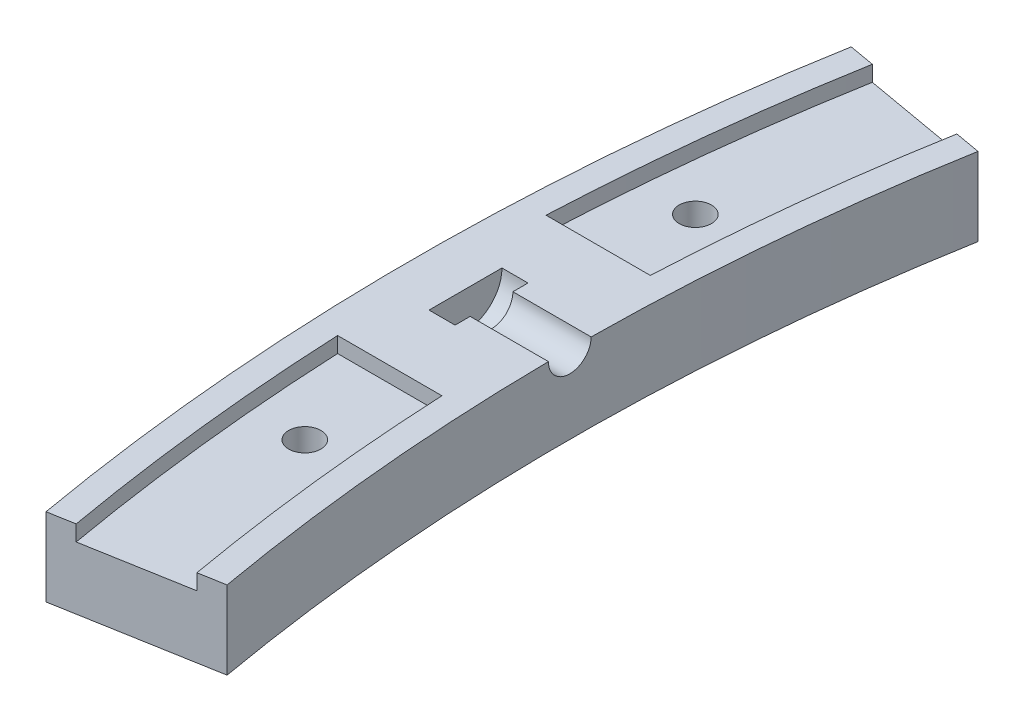
ISO-10303-21;
HEADER;
FILE_DESCRIPTION(('STEP AP214'),'2;1');
FILE_NAME('part.step','',(''),(''),'','','');
FILE_SCHEMA(('AUTOMOTIVE_DESIGN { 1 0 10303 214 1 1 1 1 }'));
ENDSEC;
DATA;
#1=APPLICATION_CONTEXT('core data for automotive mechanical design processes');
#2=APPLICATION_PROTOCOL_DEFINITION('international standard','automotive_design',2000,#1);
#3=PRODUCT_CONTEXT('',#1,'mechanical');
#4=PRODUCT('Part','Part','',(#3));
#5=PRODUCT_RELATED_PRODUCT_CATEGORY('part','',(#4));
#6=PRODUCT_DEFINITION_FORMATION('','',#4);
#7=PRODUCT_DEFINITION_CONTEXT('part definition',#1,'design');
#8=PRODUCT_DEFINITION('design','',#6,#7);
#9=PRODUCT_DEFINITION_SHAPE('','',#8);
#10=(LENGTH_UNIT() NAMED_UNIT(*) SI_UNIT(.MILLI.,.METRE.));
#11=(NAMED_UNIT(*) PLANE_ANGLE_UNIT() SI_UNIT($,.RADIAN.));
#12=(NAMED_UNIT(*) SI_UNIT($,.STERADIAN.) SOLID_ANGLE_UNIT());
#13=UNCERTAINTY_MEASURE_WITH_UNIT(LENGTH_MEASURE(1.E-05),#10,'distance_accuracy_value','');
#14=(GEOMETRIC_REPRESENTATION_CONTEXT(3) GLOBAL_UNCERTAINTY_ASSIGNED_CONTEXT((#13)) GLOBAL_UNIT_ASSIGNED_CONTEXT((#10,
#11,#12)) REPRESENTATION_CONTEXT('',''));
#15=CARTESIAN_POINT('',(0.,0.,0.));
#16=DIRECTION('',(0.,0.,1.));
#17=DIRECTION('',(1.,0.,0.));
#18=AXIS2_PLACEMENT_3D('',#15,#16,#17);
#19=CARTESIAN_POINT('',(0.,7.5,0.));
#20=DIRECTION('',(0.,1.,0.));
#21=DIRECTION('',(0.,0.,1.));
#22=AXIS2_PLACEMENT_3D('',#19,#20,#21);
#23=PLANE('',#22);
#24=DIRECTION('',(0.,0.,-1.));
#25=VECTOR('',#24,1.);
#26=CARTESIAN_POINT('',(-215.,7.5,0.));
#27=LINE('',#26,#25);
#28=CARTESIAN_POINT('',(-215.,7.5,-2.05000000000003));
#29=VERTEX_POINT('',#28);
#30=CARTESIAN_POINT('',(-215.,7.5,-3.50000000000003));
#31=VERTEX_POINT('',#30);
#32=EDGE_CURVE('E163',#29,#31,#27,.T.);
#33=ORIENTED_EDGE('',*,*,#32,.F.);
#34=DIRECTION('',(-1.,0.,0.));
#35=VECTOR('',#34,1.);
#36=CARTESIAN_POINT('',(-204.347608750033,7.5,-2.05000000000003));
#37=LINE('',#36,#35);
#38=CARTESIAN_POINT('',(-207.489873246865,7.5,-2.05000000000003));
#39=VERTEX_POINT('',#38);
#40=EDGE_CURVE('E51',#29,#39,#37,.F.);
#41=ORIENTED_EDGE('',*,*,#40,.T.);
#42=CARTESIAN_POINT('',(0.,7.5,0.));
#43=DIRECTION('',(0.,-1.,0.));
#44=DIRECTION('',(0.,0.,1.));
#45=AXIS2_PLACEMENT_3D('',#42,#43,#44);
#46=CIRCLE('',#45,207.5);
#47=CARTESIAN_POINT('',(-204.347608750033,7.5,-36.0319968658881));
#48=VERTEX_POINT('',#47);
#49=EDGE_CURVE('E278',#39,#48,#46,.T.);
#50=ORIENTED_EDGE('',*,*,#49,.T.);
#51=DIRECTION('',(-0.984807753012208,0.,-0.173648177666931));
#52=VECTOR('',#51,1.);
#53=CARTESIAN_POINT('',(-219.119725045216,7.5,-38.6367195308921));
#54=LINE('',#53,#52);
#55=CARTESIAN_POINT('',(-206.809628132564,7.5,-36.4661173100556));
#56=VERTEX_POINT('',#55);
#57=EDGE_CURVE('E265',#48,#56,#54,.T.);
#58=ORIENTED_EDGE('',*,*,#57,.T.);
#59=CARTESIAN_POINT('',(0.,7.5,0.));
#60=DIRECTION('',(0.,1.,0.));
#61=DIRECTION('',(0.,0.,1.));
#62=AXIS2_PLACEMENT_3D('',#59,#60,#61);
#63=CIRCLE('',#62,210.);
#64=CARTESIAN_POINT('',(-209.76176963403,7.5,-9.99999999999995));
#65=VERTEX_POINT('',#64);
#66=EDGE_CURVE('E276',#56,#65,#63,.T.);
#67=ORIENTED_EDGE('',*,*,#66,.T.);
#68=DIRECTION('',(-1.,0.,0.));
#69=VECTOR('',#68,1.);
#70=CARTESIAN_POINT('',(0.,7.5,-10.0000000000001));
#71=LINE('',#70,#69);
#72=CARTESIAN_POINT('',(-219.772609758359,7.5,-9.99999999999995));
#73=VERTEX_POINT('',#72);
#74=EDGE_CURVE('E363',#65,#73,#71,.T.);
#75=ORIENTED_EDGE('',*,*,#74,.T.);
#76=CARTESIAN_POINT('',(0.,7.5,0.));
#77=DIRECTION('',(0.,1.,0.));
#78=DIRECTION('',(0.,0.,1.));
#79=AXIS2_PLACEMENT_3D('',#76,#77,#78);
#80=CIRCLE('',#79,220.);
#81=CARTESIAN_POINT('',(-216.657705662686,7.5,-38.2025990867247));
#82=VERTEX_POINT('',#81);
#83=EDGE_CURVE('E370',#82,#73,#80,.T.);
#84=ORIENTED_EDGE('',*,*,#83,.F.);
#85=CARTESIAN_POINT('',(-219.119725045216,7.5,-38.6367195308921));
#86=VERTEX_POINT('',#85);
#87=EDGE_CURVE('E281',#82,#86,#54,.T.);
#88=ORIENTED_EDGE('',*,*,#87,.T.);
#89=CARTESIAN_POINT('',(0.,7.5,0.));
#90=DIRECTION('',(0.,1.,0.));
#91=DIRECTION('',(0.,0.,1.));
#92=AXIS2_PLACEMENT_3D('',#89,#90,#91);
#93=CIRCLE('',#92,222.5);
#94=CARTESIAN_POINT('',(-219.119725045216,7.5,38.6367195308921));
#95=VERTEX_POINT('',#94);
#96=EDGE_CURVE('E298',#86,#95,#93,.T.);
#97=ORIENTED_EDGE('',*,*,#96,.T.);
#98=DIRECTION('',(0.984807753012208,0.,-0.173648177666931));
#99=VECTOR('',#98,1.);
#100=CARTESIAN_POINT('',(-204.347608750033,7.5,36.0319968658881));
#101=LINE('',#100,#99);
#102=CARTESIAN_POINT('',(-216.657705662686,7.5,38.2025990867249));
#103=VERTEX_POINT('',#102);
#104=EDGE_CURVE('E310',#95,#103,#101,.T.);
#105=ORIENTED_EDGE('',*,*,#104,.T.);
#106=CARTESIAN_POINT('',(0.,7.5,0.));
#107=DIRECTION('',(0.,1.,0.));
#108=DIRECTION('',(0.,0.,1.));
#109=AXIS2_PLACEMENT_3D('',#106,#107,#108);
#110=CIRCLE('',#109,220.);
#111=CARTESIAN_POINT('',(-219.772609758359,7.5,10.));
#112=VERTEX_POINT('',#111);
#113=EDGE_CURVE('E325',#112,#103,#110,.T.);
#114=ORIENTED_EDGE('',*,*,#113,.F.);
#115=DIRECTION('',(1.,0.,0.));
#116=VECTOR('',#115,1.);
#117=CARTESIAN_POINT('',(0.,7.5,10.0000000000001));
#118=LINE('',#117,#116);
#119=CARTESIAN_POINT('',(-209.76176963403,7.5,10.));
#120=VERTEX_POINT('',#119);
#121=EDGE_CURVE('E328',#112,#120,#118,.T.);
#122=ORIENTED_EDGE('',*,*,#121,.T.);
#123=CARTESIAN_POINT('',(0.,7.5,0.));
#124=DIRECTION('',(0.,1.,0.));
#125=DIRECTION('',(0.,0.,1.));
#126=AXIS2_PLACEMENT_3D('',#123,#124,#125);
#127=CIRCLE('',#126,210.);
#128=CARTESIAN_POINT('',(-206.809628132564,7.5,36.4661173100556));
#129=VERTEX_POINT('',#128);
#130=EDGE_CURVE('E333',#120,#129,#127,.T.);
#131=ORIENTED_EDGE('',*,*,#130,.T.);
#132=CARTESIAN_POINT('',(-204.347608750033,7.5,36.0319968658881));
#133=VERTEX_POINT('',#132);
#134=EDGE_CURVE('E318',#129,#133,#101,.T.);
#135=ORIENTED_EDGE('',*,*,#134,.T.);
#136=CARTESIAN_POINT('',(-207.489873246865,7.5,2.04999999999997));
#137=VERTEX_POINT('',#136);
#138=EDGE_CURVE('E158',#133,#137,#46,.T.);
#139=ORIENTED_EDGE('',*,*,#138,.T.);
#140=DIRECTION('',(-1.,0.,0.));
#141=VECTOR('',#140,1.);
#142=CARTESIAN_POINT('',(-204.347608750033,7.5,2.04999999999997));
#143=LINE('',#142,#141);
#144=CARTESIAN_POINT('',(-215.,7.5,2.04999999999997));
#145=VERTEX_POINT('',#144);
#146=EDGE_CURVE('E149',#137,#145,#143,.T.);
#147=ORIENTED_EDGE('',*,*,#146,.T.);
#148=CARTESIAN_POINT('',(-215.,7.5,3.49999999999997));
#149=VERTEX_POINT('',#148);
#150=EDGE_CURVE('E156',#149,#145,#27,.T.);
#151=ORIENTED_EDGE('',*,*,#150,.F.);
#152=DIRECTION('',(1.,0.,0.));
#153=VECTOR('',#152,1.);
#154=CARTESIAN_POINT('',(-217.5,7.5,3.49999999999997));
#155=LINE('',#154,#153);
#156=CARTESIAN_POINT('',(-217.5,7.5,3.49999999999997));
#157=VERTEX_POINT('',#156);
#158=EDGE_CURVE('E165',#157,#149,#155,.T.);
#159=ORIENTED_EDGE('',*,*,#158,.F.);
#160=DIRECTION('',(0.,0.,-1.));
#161=VECTOR('',#160,1.);
#162=CARTESIAN_POINT('',(-217.5,7.5,0.));
#163=LINE('',#162,#161);
#164=CARTESIAN_POINT('',(-217.5,7.5,-3.50000000000003));
#165=VERTEX_POINT('',#164);
#166=EDGE_CURVE('E44',#157,#165,#163,.T.);
#167=ORIENTED_EDGE('',*,*,#166,.T.);
#168=DIRECTION('',(1.,0.,0.));
#169=VECTOR('',#168,1.);
#170=CARTESIAN_POINT('',(-217.5,7.5,-3.50000000000003));
#171=LINE('',#170,#169);
#172=EDGE_CURVE('E162',#31,#165,#171,.F.);
#173=ORIENTED_EDGE('',*,*,#172,.F.);
#174=EDGE_LOOP('',(#33,#41,#50,#58,#67,#75,#84,#88,#97,#105,#114,#122,#131,#135,#139,#147,#151,
#159,#167,#173));
#175=FACE_BOUND('',#174,.T.);
#176=ADVANCED_FACE('F35',(#175),#23,.T.);
#177=CARTESIAN_POINT('',(0.,7.5,0.));
#178=DIRECTION('',(0.,-1.,0.));
#179=DIRECTION('',(0.,0.,-1.));
#180=AXIS2_PLACEMENT_3D('',#177,#178,#179);
#181=CYLINDRICAL_SURFACE('',#180,207.5);
#182=CARTESIAN_POINT('',(-207.489873246865,7.5,2.04999999999997));
#183=CARTESIAN_POINT('',(-207.489873112115,7.4423267773774,2.04999961874439));
#184=CARTESIAN_POINT('',(-207.489897323521,7.3846811873352,2.04756466829248));
#185=CARTESIAN_POINT('',(-207.489993010362,7.26980251110975,2.03785066983751));
#186=CARTESIAN_POINT('',(-207.490064483525,7.21256940523499,2.03057185464416));
#187=CARTESIAN_POINT('',(-207.490347355248,7.04219804038056,2.00153779102663));
#188=CARTESIAN_POINT('',(-207.490627214969,6.93020109577207,1.97258473937086));
#189=CARTESIAN_POINT('',(-207.491338438396,6.7126631089907,1.89628879865608));
#190=CARTESIAN_POINT('',(-207.491769872239,6.60712508212359,1.84893739511039));
#191=CARTESIAN_POINT('',(-207.49273544386,6.40550172133171,1.73719531036377));
#192=CARTESIAN_POINT('',(-207.493269561529,6.30941454218551,1.67280796442357));
#193=CARTESIAN_POINT('',(-207.494380389939,6.1294114605521,1.52881471104663));
#194=CARTESIAN_POINT('',(-207.494957102911,6.0454961967325,1.44920800554874));
#195=CARTESIAN_POINT('',(-207.496088173847,5.89220729571771,1.27702384443452));
#196=CARTESIAN_POINT('',(-207.496642528392,5.8228358749963,1.18444441536379));
#197=CARTESIAN_POINT('',(-207.49766627226,5.70062318173759,0.988954551643307));
#198=CARTESIAN_POINT('',(-207.498135663594,5.64778151765516,0.88604436177756));
#199=CARTESIAN_POINT('',(-207.498936547642,5.56012883511326,0.672819361395598));
#200=CARTESIAN_POINT('',(-207.499268049205,5.52531665961146,0.562505026553703));
#201=CARTESIAN_POINT('',(-207.499755821048,5.47470668258269,0.337598710251014));
#202=CARTESIAN_POINT('',(-207.499912093538,5.45890864121722,0.22300678276527));
#203=CARTESIAN_POINT('',(-207.500031797858,5.4467745828185,-0.00720562877474218));
#204=CARTESIAN_POINT('',(-207.499995225299,5.45043900875719,-0.122826136180022));
#205=CARTESIAN_POINT('',(-207.499733358717,5.47712623948218,-0.351805502754212));
#206=CARTESIAN_POINT('',(-207.499508073155,5.50014817630441,-0.465164463094469));
#207=CARTESIAN_POINT('',(-207.498894190051,5.5648955326389,-0.686407934748474));
#208=CARTESIAN_POINT('',(-207.498505593007,5.60662089499921,-0.794292462789289));
#209=CARTESIAN_POINT('',(-207.497608873338,5.70759259971319,-1.00152986625007));
#210=CARTESIAN_POINT('',(-207.49710074546,5.76683971202467,-1.10088236649974));
#211=CARTESIAN_POINT('',(-207.496022284363,5.90116958629022,-1.28822582777586));
#212=CARTESIAN_POINT('',(-207.495451954187,5.97625157349768,-1.37621734431719));
#213=CARTESIAN_POINT('',(-207.49431340944,6.14011242982959,-1.53833981562478));
#214=CARTESIAN_POINT('',(-207.49374519468,6.22889004474803,-1.61247203821151));
#215=CARTESIAN_POINT('',(-207.492674703444,6.41766570271724,-1.74480366525922));
#216=CARTESIAN_POINT('',(-207.492172447978,6.51766730200719,-1.80299799970906));
#217=CARTESIAN_POINT('',(-207.491290450375,6.72606417828469,-1.90179901283657));
#218=CARTESIAN_POINT('',(-207.490910782999,6.83446452740496,-1.942394964446));
#219=CARTESIAN_POINT('',(-207.490317771501,7.056458109655,-2.00474925697139));
#220=CARTESIAN_POINT('',(-207.490104173403,7.17004313081143,-2.02653636879362));
#221=CARTESIAN_POINT('',(-207.489947910169,7.3203192776388,-2.04242998940697));
#222=CARTESIAN_POINT('',(-207.489919925655,7.3562282993136,-2.04527024245444));
#223=CARTESIAN_POINT('',(-207.489882619008,7.42808670006453,-2.04905265607338));
#224=CARTESIAN_POINT('',(-207.489873266096,7.46403591425759,-2.04999794707387));
#225=CARTESIAN_POINT('',(-207.489873246865,7.5,-2.05000000000003));
#226=B_SPLINE_CURVE_WITH_KNOTS('',3,(#182,#183,#184,#185,#186,#187,#188,#189,#190,#191,#192,
#193,#194,#195,#196,#197,#198,#199,#200,#201,#202,#203,#204,#205,#206,#207,#208,#209,#210,#211,
#212,#213,#214,#215,#216,#217,#218,#219,#220,#221,#222,#223,#224,#225),.UNSPECIFIED.,.F.,.F.,(4,
2,2,2,2,2,2,2,2,2,2,2,2,2,2,2,2,2,2,2,2,4),(0.,0.17291339027685,0.34581847045188,
0.691075842377868,1.0364931850116,1.38184295254384,1.7272108342329,2.07263131159989,
2.41804360627244,2.76343373136544,3.10881949976694,3.45421312929192,3.79959127266908,
4.14496836068347,4.49036062784999,4.8357360000652,5.1810797625568,5.52653325529349,
5.87219702361998,6.21733110637327,6.32535981214613,6.43320990969692),.UNSPECIFIED.);
#227=EDGE_CURVE('E159',#137,#39,#226,.T.);
#228=ORIENTED_EDGE('',*,*,#227,.F.);
#229=ORIENTED_EDGE('',*,*,#138,.F.);
#230=DIRECTION('',(0.,-1.,0.));
#231=VECTOR('',#230,1.);
#232=CARTESIAN_POINT('',(-204.347608750033,7.5,36.0319968658881));
#233=LINE('',#232,#231);
#234=CARTESIAN_POINT('',(-204.347608750033,0.,36.0319968658881));
#235=VERTEX_POINT('',#234);
#236=EDGE_CURVE('E300',#133,#235,#233,.T.);
#237=ORIENTED_EDGE('',*,*,#236,.T.);
#238=CARTESIAN_POINT('',(0.,0.,0.));
#239=DIRECTION('',(0.,-1.,0.));
#240=DIRECTION('',(0.,0.,1.));
#241=AXIS2_PLACEMENT_3D('',#238,#239,#240);
#242=CIRCLE('',#241,207.5);
#243=CARTESIAN_POINT('',(-204.347608750033,0.,-36.0319968658881));
#244=VERTEX_POINT('',#243);
#245=EDGE_CURVE('E295',#235,#244,#242,.T.);
#246=ORIENTED_EDGE('',*,*,#245,.T.);
#247=DIRECTION('',(0.,-1.,0.));
#248=VECTOR('',#247,1.);
#249=CARTESIAN_POINT('',(-204.347608750033,7.5,-36.0319968658881));
#250=LINE('',#249,#248);
#251=EDGE_CURVE('E284',#48,#244,#250,.T.);
#252=ORIENTED_EDGE('',*,*,#251,.F.);
#253=ORIENTED_EDGE('',*,*,#49,.F.);
#254=EDGE_LOOP('',(#228,#229,#237,#246,#252,#253));
#255=FACE_BOUND('',#254,.T.);
#256=ADVANCED_FACE('F193',(#255),#181,.F.);
#257=CARTESIAN_POINT('',(-204.347608750033,7.5,36.0319968658881));
#258=DIRECTION('',(-0.173648177666931,0.,-0.984807753012208));
#259=DIRECTION('',(-0.984807753012208,0.,0.173648177666931));
#260=AXIS2_PLACEMENT_3D('',#257,#258,#259);
#261=PLANE('',#260);
#262=DIRECTION('',(0.,1.,0.));
#263=VECTOR('',#262,1.);
#264=CARTESIAN_POINT('',(-206.809628132564,6.,36.4661173100556));
#265=LINE('',#264,#263);
#266=CARTESIAN_POINT('',(-206.809628132564,6.,36.4661173100556));
#267=VERTEX_POINT('',#266);
#268=EDGE_CURVE('E337',#267,#129,#265,.T.);
#269=ORIENTED_EDGE('',*,*,#268,.F.);
#270=DIRECTION('',(0.984807753012208,0.,-0.173648177666931));
#271=VECTOR('',#270,1.);
#272=CARTESIAN_POINT('',(0.,6.,0.));
#273=LINE('',#272,#271);
#274=CARTESIAN_POINT('',(-216.657705662686,6.,38.2025990867249));
#275=VERTEX_POINT('',#274);
#276=EDGE_CURVE('E343',#275,#267,#273,.T.);
#277=ORIENTED_EDGE('',*,*,#276,.F.);
#278=DIRECTION('',(0.,1.,0.));
#279=VECTOR('',#278,1.);
#280=CARTESIAN_POINT('',(-216.657705662686,6.,38.2025990867249));
#281=LINE('',#280,#279);
#282=EDGE_CURVE('E339',#275,#103,#281,.T.);
#283=ORIENTED_EDGE('',*,*,#282,.T.);
#284=ORIENTED_EDGE('',*,*,#104,.F.);
#285=DIRECTION('',(0.,-1.,0.));
#286=VECTOR('',#285,1.);
#287=CARTESIAN_POINT('',(-219.119725045216,7.5,38.6367195308921));
#288=LINE('',#287,#286);
#289=CARTESIAN_POINT('',(-219.119725045216,0.,38.6367195308921));
#290=VERTEX_POINT('',#289);
#291=EDGE_CURVE('E167',#95,#290,#288,.T.);
#292=ORIENTED_EDGE('',*,*,#291,.T.);
#293=DIRECTION('',(0.984807753012208,0.,-0.173648177666931));
#294=VECTOR('',#293,1.);
#295=CARTESIAN_POINT('',(-204.347608750033,0.,36.0319968658881));
#296=LINE('',#295,#294);
#297=EDGE_CURVE('E292',#290,#235,#296,.T.);
#298=ORIENTED_EDGE('',*,*,#297,.T.);
#299=ORIENTED_EDGE('',*,*,#236,.F.);
#300=ORIENTED_EDGE('',*,*,#134,.F.);
#301=EDGE_LOOP('',(#269,#277,#283,#284,#292,#298,#299,#300));
#302=FACE_BOUND('',#301,.T.);
#303=ADVANCED_FACE('F251',(#302),#261,.F.);
#304=CARTESIAN_POINT('',(-219.119725045216,7.5,-38.6367195308921));
#305=DIRECTION('',(-0.173648177666931,0.,0.984807753012208));
#306=DIRECTION('',(0.984807753012208,0.,0.173648177666931));
#307=AXIS2_PLACEMENT_3D('',#304,#305,#306);
#308=PLANE('',#307);
#309=DIRECTION('',(0.,1.,0.));
#310=VECTOR('',#309,1.);
#311=CARTESIAN_POINT('',(-206.809628132564,6.,-36.4661173100556));
#312=LINE('',#311,#310);
#313=CARTESIAN_POINT('',(-206.809628132564,6.,-36.4661173100556));
#314=VERTEX_POINT('',#313);
#315=EDGE_CURVE('E262',#314,#56,#312,.T.);
#316=ORIENTED_EDGE('',*,*,#315,.T.);
#317=ORIENTED_EDGE('',*,*,#57,.F.);
#318=ORIENTED_EDGE('',*,*,#251,.T.);
#319=DIRECTION('',(-0.984807753012208,0.,-0.173648177666931));
#320=VECTOR('',#319,1.);
#321=CARTESIAN_POINT('',(-219.119725045216,0.,-38.6367195308921));
#322=LINE('',#321,#320);
#323=CARTESIAN_POINT('',(-219.119725045216,0.,-38.6367195308921));
#324=VERTEX_POINT('',#323);
#325=EDGE_CURVE('E297',#244,#324,#322,.T.);
#326=ORIENTED_EDGE('',*,*,#325,.T.);
#327=DIRECTION('',(0.,-1.,0.));
#328=VECTOR('',#327,1.);
#329=CARTESIAN_POINT('',(-219.119725045216,7.5,-38.6367195308921));
#330=LINE('',#329,#328);
#331=EDGE_CURVE('E280',#86,#324,#330,.T.);
#332=ORIENTED_EDGE('',*,*,#331,.F.);
#333=ORIENTED_EDGE('',*,*,#87,.F.);
#334=DIRECTION('',(0.,1.,0.));
#335=VECTOR('',#334,1.);
#336=CARTESIAN_POINT('',(-216.657705662686,6.,-38.2025990867249));
#337=LINE('',#336,#335);
#338=CARTESIAN_POINT('',(-216.657705662686,6.,-38.2025990867249));
#339=VERTEX_POINT('',#338);
#340=EDGE_CURVE('E271',#339,#82,#337,.T.);
#341=ORIENTED_EDGE('',*,*,#340,.F.);
#342=DIRECTION('',(-0.984807753012208,0.,-0.173648177666931));
#343=VECTOR('',#342,1.);
#344=CARTESIAN_POINT('',(0.,6.,0.));
#345=LINE('',#344,#343);
#346=EDGE_CURVE('E268',#314,#339,#345,.T.);
#347=ORIENTED_EDGE('',*,*,#346,.F.);
#348=EDGE_LOOP('',(#316,#317,#318,#326,#332,#333,#341,#347));
#349=FACE_BOUND('',#348,.T.);
#350=ADVANCED_FACE('F249',(#349),#308,.F.);
#351=CARTESIAN_POINT('',(0.,7.5,0.));
#352=DIRECTION('',(0.,-1.,0.));
#353=DIRECTION('',(0.,0.,-1.));
#354=AXIS2_PLACEMENT_3D('',#351,#352,#353);
#355=CYLINDRICAL_SURFACE('',#354,222.5);
#356=CARTESIAN_POINT('',(0.,0.,0.));
#357=DIRECTION('',(0.,1.,0.));
#358=DIRECTION('',(0.,0.,1.));
#359=AXIS2_PLACEMENT_3D('',#356,#357,#358);
#360=CIRCLE('',#359,222.5);
#361=EDGE_CURVE('E289',#324,#290,#360,.T.);
#362=ORIENTED_EDGE('',*,*,#361,.T.);
#363=ORIENTED_EDGE('',*,*,#291,.F.);
#364=ORIENTED_EDGE('',*,*,#96,.F.);
#365=ORIENTED_EDGE('',*,*,#331,.T.);
#366=EDGE_LOOP('',(#362,#363,#364,#365));
#367=FACE_BOUND('',#366,.T.);
#368=ADVANCED_FACE('F37',(#367),#355,.T.);
#369=CARTESIAN_POINT('',(0.,0.,0.));
#370=DIRECTION('',(0.,1.,0.));
#371=DIRECTION('',(0.,0.,1.));
#372=AXIS2_PLACEMENT_3D('',#369,#370,#371);
#373=PLANE('',#372);
#374=CARTESIAN_POINT('',(-214.181860089725,0.,18.7384846907465));
#375=DIRECTION('',(0.,-1.,0.));
#376=DIRECTION('',(0.,0.,-1.));
#377=AXIS2_PLACEMENT_3D('',#374,#375,#376);
#378=CIRCLE('',#377,1.55);
#379=CARTESIAN_POINT('',(-214.181860089725,0.,17.1884846907465));
#380=VERTEX_POINT('',#379);
#381=EDGE_CURVE('E184',#380,#380,#378,.T.);
#382=ORIENTED_EDGE('',*,*,#381,.F.);
#383=EDGE_LOOP('',(#382));
#384=FACE_BOUND('',#383,.T.);
#385=CARTESIAN_POINT('',(-214.181860089725,0.,-18.7384846907466));
#386=DIRECTION('',(0.,-1.,0.));
#387=DIRECTION('',(0.,0.,-1.));
#388=AXIS2_PLACEMENT_3D('',#385,#386,#387);
#389=CIRCLE('',#388,1.55);
#390=CARTESIAN_POINT('',(-214.181860089725,0.,-20.2884846907466));
#391=VERTEX_POINT('',#390);
#392=EDGE_CURVE('E175',#391,#391,#389,.T.);
#393=ORIENTED_EDGE('',*,*,#392,.F.);
#394=EDGE_LOOP('',(#393));
#395=FACE_BOUND('',#394,.T.);
#396=ORIENTED_EDGE('',*,*,#361,.F.);
#397=ORIENTED_EDGE('',*,*,#325,.F.);
#398=ORIENTED_EDGE('',*,*,#245,.F.);
#399=ORIENTED_EDGE('',*,*,#297,.F.);
#400=EDGE_LOOP('',(#396,#397,#398,#399));
#401=FACE_BOUND('',#400,.T.);
#402=ADVANCED_FACE('F243',(#384,#395,#401),#373,.F.);
#403=CARTESIAN_POINT('',(0.,6.,0.));
#404=DIRECTION('',(0.,1.,0.));
#405=DIRECTION('',(0.,0.,1.));
#406=AXIS2_PLACEMENT_3D('',#403,#404,#405);
#407=CYLINDRICAL_SURFACE('',#406,210.);
#408=ORIENTED_EDGE('',*,*,#130,.F.);
#409=DIRECTION('',(0.,1.,0.));
#410=VECTOR('',#409,1.);
#411=CARTESIAN_POINT('',(-209.76176963403,6.,10.));
#412=LINE('',#411,#410);
#413=CARTESIAN_POINT('',(-209.76176963403,6.,10.));
#414=VERTEX_POINT('',#413);
#415=EDGE_CURVE('E321',#414,#120,#412,.T.);
#416=ORIENTED_EDGE('',*,*,#415,.F.);
#417=CARTESIAN_POINT('',(0.,6.,0.));
#418=DIRECTION('',(0.,1.,0.));
#419=DIRECTION('',(0.,0.,1.));
#420=AXIS2_PLACEMENT_3D('',#417,#418,#419);
#421=CIRCLE('',#420,210.);
#422=EDGE_CURVE('E329',#414,#267,#421,.T.);
#423=ORIENTED_EDGE('',*,*,#422,.T.);
#424=ORIENTED_EDGE('',*,*,#268,.T.);
#425=EDGE_LOOP('',(#408,#416,#423,#424));
#426=FACE_BOUND('',#425,.T.);
#427=ADVANCED_FACE('F236',(#426),#407,.T.);
#428=CARTESIAN_POINT('',(0.,6.,0.));
#429=DIRECTION('',(0.,1.,0.));
#430=DIRECTION('',(0.,0.,1.));
#431=AXIS2_PLACEMENT_3D('',#428,#429,#430);
#432=CYLINDRICAL_SURFACE('',#431,220.);
#433=ORIENTED_EDGE('',*,*,#113,.T.);
#434=ORIENTED_EDGE('',*,*,#282,.F.);
#435=CARTESIAN_POINT('',(0.,6.,0.));
#436=DIRECTION('',(0.,1.,0.));
#437=DIRECTION('',(0.,0.,1.));
#438=AXIS2_PLACEMENT_3D('',#435,#436,#437);
#439=CIRCLE('',#438,220.);
#440=CARTESIAN_POINT('',(-219.772609758359,6.,10.));
#441=VERTEX_POINT('',#440);
#442=EDGE_CURVE('E346',#441,#275,#439,.T.);
#443=ORIENTED_EDGE('',*,*,#442,.F.);
#444=DIRECTION('',(0.,1.,0.));
#445=VECTOR('',#444,1.);
#446=CARTESIAN_POINT('',(-219.772609758359,6.,10.));
#447=LINE('',#446,#445);
#448=EDGE_CURVE('E340',#441,#112,#447,.T.);
#449=ORIENTED_EDGE('',*,*,#448,.T.);
#450=EDGE_LOOP('',(#433,#434,#443,#449));
#451=FACE_BOUND('',#450,.T.);
#452=ADVANCED_FACE('F233',(#451),#432,.F.);
#453=CARTESIAN_POINT('',(0.,6.,10.0000000000001));
#454=DIRECTION('',(0.,0.,1.));
#455=DIRECTION('',(1.,0.,0.));
#456=AXIS2_PLACEMENT_3D('',#453,#454,#455);
#457=PLANE('',#456);
#458=ORIENTED_EDGE('',*,*,#121,.F.);
#459=ORIENTED_EDGE('',*,*,#448,.F.);
#460=DIRECTION('',(1.,0.,0.));
#461=VECTOR('',#460,1.);
#462=CARTESIAN_POINT('',(0.,6.,10.0000000000001));
#463=LINE('',#462,#461);
#464=EDGE_CURVE('E331',#441,#414,#463,.T.);
#465=ORIENTED_EDGE('',*,*,#464,.T.);
#466=ORIENTED_EDGE('',*,*,#415,.T.);
#467=EDGE_LOOP('',(#458,#459,#465,#466));
#468=FACE_BOUND('',#467,.T.);
#469=ADVANCED_FACE('F231',(#468),#457,.T.);
#470=CARTESIAN_POINT('',(0.,6.,0.));
#471=DIRECTION('',(0.,1.,0.));
#472=DIRECTION('',(0.,0.,1.));
#473=AXIS2_PLACEMENT_3D('',#470,#471,#472);
#474=PLANE('',#473);
#475=CARTESIAN_POINT('',(-214.181860089725,6.,18.7384846907465));
#476=DIRECTION('',(0.,1.,0.));
#477=DIRECTION('',(0.,0.,1.));
#478=AXIS2_PLACEMENT_3D('',#475,#476,#477);
#479=CIRCLE('',#478,1.55);
#480=CARTESIAN_POINT('',(-214.181860089725,6.,20.2884846907465));
#481=VERTEX_POINT('',#480);
#482=EDGE_CURVE('E39',#481,#481,#479,.T.);
#483=ORIENTED_EDGE('',*,*,#482,.F.);
#484=EDGE_LOOP('',(#483));
#485=FACE_BOUND('',#484,.T.);
#486=ORIENTED_EDGE('',*,*,#422,.F.);
#487=ORIENTED_EDGE('',*,*,#464,.F.);
#488=ORIENTED_EDGE('',*,*,#442,.T.);
#489=ORIENTED_EDGE('',*,*,#276,.T.);
#490=EDGE_LOOP('',(#486,#487,#488,#489));
#491=FACE_BOUND('',#490,.T.);
#492=ADVANCED_FACE('F227',(#485,#491),#474,.T.);
#493=CARTESIAN_POINT('',(0.,6.,0.));
#494=DIRECTION('',(0.,1.,0.));
#495=DIRECTION('',(0.,0.,1.));
#496=AXIS2_PLACEMENT_3D('',#493,#494,#495);
#497=CYLINDRICAL_SURFACE('',#496,210.);
#498=ORIENTED_EDGE('',*,*,#66,.F.);
#499=ORIENTED_EDGE('',*,*,#315,.F.);
#500=CARTESIAN_POINT('',(0.,6.,0.));
#501=DIRECTION('',(0.,1.,0.));
#502=DIRECTION('',(0.,0.,1.));
#503=AXIS2_PLACEMENT_3D('',#500,#501,#502);
#504=CIRCLE('',#503,210.);
#505=CARTESIAN_POINT('',(-209.76176963403,6.,-9.99999999999995));
#506=VERTEX_POINT('',#505);
#507=EDGE_CURVE('E361',#314,#506,#504,.T.);
#508=ORIENTED_EDGE('',*,*,#507,.T.);
#509=DIRECTION('',(0.,1.,0.));
#510=VECTOR('',#509,1.);
#511=CARTESIAN_POINT('',(-209.76176963403,6.,-9.99999999999995));
#512=LINE('',#511,#510);
#513=EDGE_CURVE('E293',#506,#65,#512,.T.);
#514=ORIENTED_EDGE('',*,*,#513,.T.);
#515=EDGE_LOOP('',(#498,#499,#508,#514));
#516=FACE_BOUND('',#515,.T.);
#517=ADVANCED_FACE('F220',(#516),#497,.T.);
#518=CARTESIAN_POINT('',(0.,6.,-10.0000000000001));
#519=DIRECTION('',(0.,0.,-1.));
#520=DIRECTION('',(-1.,0.,0.));
#521=AXIS2_PLACEMENT_3D('',#518,#519,#520);
#522=PLANE('',#521);
#523=ORIENTED_EDGE('',*,*,#74,.F.);
#524=ORIENTED_EDGE('',*,*,#513,.F.);
#525=DIRECTION('',(-1.,0.,0.));
#526=VECTOR('',#525,1.);
#527=CARTESIAN_POINT('',(0.,6.,-10.0000000000001));
#528=LINE('',#527,#526);
#529=CARTESIAN_POINT('',(-219.772609758359,6.,-9.99999999999995));
#530=VERTEX_POINT('',#529);
#531=EDGE_CURVE('E272',#506,#530,#528,.T.);
#532=ORIENTED_EDGE('',*,*,#531,.T.);
#533=DIRECTION('',(0.,1.,0.));
#534=VECTOR('',#533,1.);
#535=CARTESIAN_POINT('',(-219.772609758359,6.,-9.99999999999995));
#536=LINE('',#535,#534);
#537=EDGE_CURVE('E376',#530,#73,#536,.T.);
#538=ORIENTED_EDGE('',*,*,#537,.T.);
#539=EDGE_LOOP('',(#523,#524,#532,#538));
#540=FACE_BOUND('',#539,.T.);
#541=ADVANCED_FACE('F217',(#540),#522,.T.);
#542=CARTESIAN_POINT('',(0.,6.,0.));
#543=DIRECTION('',(0.,1.,0.));
#544=DIRECTION('',(0.,0.,1.));
#545=AXIS2_PLACEMENT_3D('',#542,#543,#544);
#546=CYLINDRICAL_SURFACE('',#545,220.);
#547=ORIENTED_EDGE('',*,*,#83,.T.);
#548=ORIENTED_EDGE('',*,*,#537,.F.);
#549=CARTESIAN_POINT('',(0.,6.,0.));
#550=DIRECTION('',(0.,1.,0.));
#551=DIRECTION('',(0.,0.,1.));
#552=AXIS2_PLACEMENT_3D('',#549,#550,#551);
#553=CIRCLE('',#552,220.);
#554=EDGE_CURVE('E365',#339,#530,#553,.T.);
#555=ORIENTED_EDGE('',*,*,#554,.F.);
#556=ORIENTED_EDGE('',*,*,#340,.T.);
#557=EDGE_LOOP('',(#547,#548,#555,#556));
#558=FACE_BOUND('',#557,.T.);
#559=ADVANCED_FACE('F215',(#558),#546,.F.);
#560=CARTESIAN_POINT('',(0.,6.,0.));
#561=DIRECTION('',(0.,1.,0.));
#562=DIRECTION('',(0.,0.,1.));
#563=AXIS2_PLACEMENT_3D('',#560,#561,#562);
#564=PLANE('',#563);
#565=CARTESIAN_POINT('',(-214.181860089725,6.,-18.7384846907466));
#566=DIRECTION('',(0.,1.,0.));
#567=DIRECTION('',(0.,0.,1.));
#568=AXIS2_PLACEMENT_3D('',#565,#566,#567);
#569=CIRCLE('',#568,1.55);
#570=CARTESIAN_POINT('',(-214.181860089725,6.,-17.1884846907466));
#571=VERTEX_POINT('',#570);
#572=EDGE_CURVE('E173',#571,#571,#569,.T.);
#573=ORIENTED_EDGE('',*,*,#572,.F.);
#574=EDGE_LOOP('',(#573));
#575=FACE_BOUND('',#574,.T.);
#576=ORIENTED_EDGE('',*,*,#507,.F.);
#577=ORIENTED_EDGE('',*,*,#346,.T.);
#578=ORIENTED_EDGE('',*,*,#554,.T.);
#579=ORIENTED_EDGE('',*,*,#531,.F.);
#580=EDGE_LOOP('',(#576,#577,#578,#579));
#581=FACE_BOUND('',#580,.T.);
#582=ADVANCED_FACE('F211',(#575,#581),#564,.T.);
#583=CARTESIAN_POINT('',(-217.5,7.5,0.));
#584=DIRECTION('',(1.,0.,0.));
#585=DIRECTION('',(0.,0.,-1.));
#586=AXIS2_PLACEMENT_3D('',#583,#584,#585);
#587=CYLINDRICAL_SURFACE('',#586,3.5);
#588=ORIENTED_EDGE('',*,*,#158,.T.);
#589=CARTESIAN_POINT('',(-215.,7.5,0.));
#590=DIRECTION('',(1.,0.,0.));
#591=DIRECTION('',(0.,0.,-1.));
#592=AXIS2_PLACEMENT_3D('',#589,#590,#591);
#593=CIRCLE('',#592,3.5);
#594=EDGE_CURVE('E59',#149,#31,#593,.T.);
#595=ORIENTED_EDGE('',*,*,#594,.T.);
#596=ORIENTED_EDGE('',*,*,#172,.T.);
#597=CARTESIAN_POINT('',(-217.5,7.5,0.));
#598=DIRECTION('',(1.,0.,0.));
#599=DIRECTION('',(0.,0.,-1.));
#600=AXIS2_PLACEMENT_3D('',#597,#598,#599);
#601=CIRCLE('',#600,3.5);
#602=EDGE_CURVE('E354',#157,#165,#601,.T.);
#603=ORIENTED_EDGE('',*,*,#602,.F.);
#604=EDGE_LOOP('',(#588,#595,#596,#603));
#605=FACE_BOUND('',#604,.T.);
#606=ADVANCED_FACE('F205',(#605),#587,.F.);
#607=CARTESIAN_POINT('',(-217.5,7.5,0.));
#608=DIRECTION('',(1.,0.,0.));
#609=DIRECTION('',(0.,0.,-1.));
#610=AXIS2_PLACEMENT_3D('',#607,#608,#609);
#611=PLANE('',#610);
#612=ORIENTED_EDGE('',*,*,#602,.T.);
#613=ORIENTED_EDGE('',*,*,#166,.F.);
#614=EDGE_LOOP('',(#612,#613));
#615=FACE_BOUND('',#614,.T.);
#616=ADVANCED_FACE('F202',(#615),#611,.T.);
#617=CARTESIAN_POINT('',(-215.,7.5,0.));
#618=DIRECTION('',(1.,0.,0.));
#619=DIRECTION('',(0.,0.,-1.));
#620=AXIS2_PLACEMENT_3D('',#617,#618,#619);
#621=PLANE('',#620);
#622=CARTESIAN_POINT('',(-215.,7.5,0.));
#623=DIRECTION('',(1.,0.,0.));
#624=DIRECTION('',(0.,0.,-1.));
#625=AXIS2_PLACEMENT_3D('',#622,#623,#624);
#626=CIRCLE('',#625,2.05);
#627=EDGE_CURVE('E11',#29,#145,#626,.F.);
#628=ORIENTED_EDGE('',*,*,#627,.F.);
#629=ORIENTED_EDGE('',*,*,#32,.T.);
#630=ORIENTED_EDGE('',*,*,#594,.F.);
#631=ORIENTED_EDGE('',*,*,#150,.T.);
#632=EDGE_LOOP('',(#628,#629,#630,#631));
#633=FACE_BOUND('',#632,.T.);
#634=ADVANCED_FACE('F161',(#633),#621,.F.);
#635=CARTESIAN_POINT('',(-204.347608750033,7.5,0.));
#636=DIRECTION('',(-1.,0.,0.));
#637=DIRECTION('',(0.,0.,1.));
#638=AXIS2_PLACEMENT_3D('',#635,#636,#637);
#639=CYLINDRICAL_SURFACE('',#638,2.05);
#640=ORIENTED_EDGE('',*,*,#627,.T.);
#641=ORIENTED_EDGE('',*,*,#146,.F.);
#642=ORIENTED_EDGE('',*,*,#227,.T.);
#643=ORIENTED_EDGE('',*,*,#40,.F.);
#644=EDGE_LOOP('',(#640,#641,#642,#643));
#645=FACE_BOUND('',#644,.T.);
#646=ADVANCED_FACE('F148',(#645),#639,.F.);
#647=CARTESIAN_POINT('',(-214.181860089725,0.,-18.7384846907466));
#648=DIRECTION('',(0.,-1.,0.));
#649=DIRECTION('',(0.,0.,-1.));
#650=AXIS2_PLACEMENT_3D('',#647,#648,#649);
#651=CYLINDRICAL_SURFACE('',#650,1.55);
#652=ORIENTED_EDGE('',*,*,#572,.T.);
#653=EDGE_LOOP('',(#652));
#654=FACE_BOUND('',#653,.T.);
#655=ORIENTED_EDGE('',*,*,#392,.T.);
#656=EDGE_LOOP('',(#655));
#657=FACE_BOUND('',#656,.T.);
#658=ADVANCED_FACE('F200',(#654,#657),#651,.F.);
#659=CARTESIAN_POINT('',(-214.181860089725,0.,18.7384846907465));
#660=DIRECTION('',(0.,-1.,0.));
#661=DIRECTION('',(0.,0.,-1.));
#662=AXIS2_PLACEMENT_3D('',#659,#660,#661);
#663=CYLINDRICAL_SURFACE('',#662,1.55);
#664=ORIENTED_EDGE('',*,*,#482,.T.);
#665=EDGE_LOOP('',(#664));
#666=FACE_BOUND('',#665,.T.);
#667=ORIENTED_EDGE('',*,*,#381,.T.);
#668=EDGE_LOOP('',(#667));
#669=FACE_BOUND('',#668,.T.);
#670=ADVANCED_FACE('F475',(#666,#669),#663,.F.);
#671=CLOSED_SHELL('',(#176,#256,#303,#350,#368,#402,#427,#452,#469,#492,#517,#541,#559,#582,
#606,#616,#634,#646,#658,#670));
#672=MANIFOLD_SOLID_BREP('B2',#671);
#673=ADVANCED_BREP_SHAPE_REPRESENTATION('',(#18,#672),#14);
#674=SHAPE_DEFINITION_REPRESENTATION(#9,#673);
ENDSEC;
END-ISO-10303-21;
